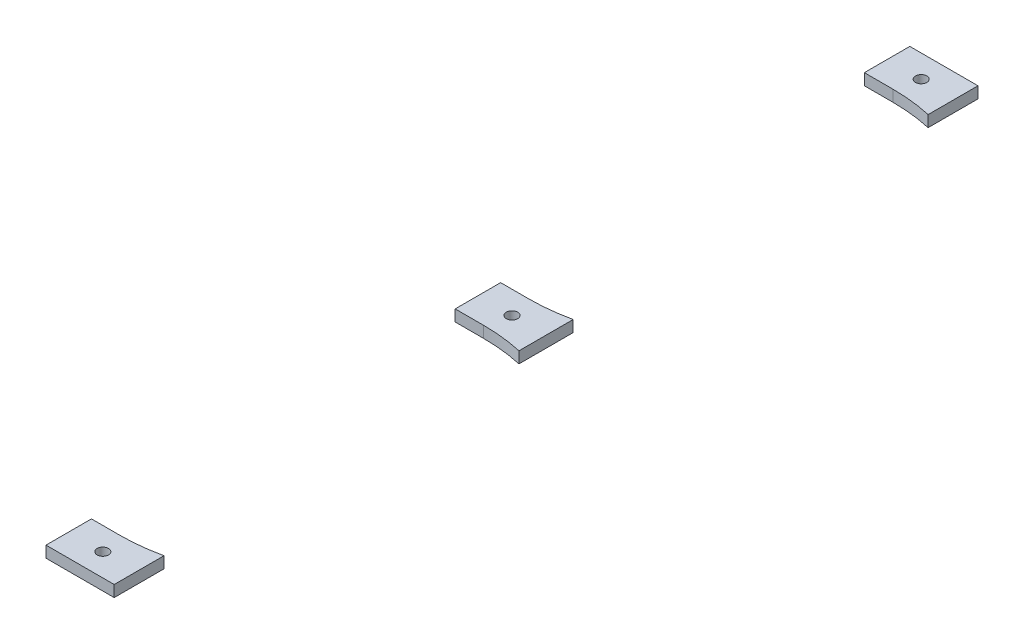
ISO-10303-21;
HEADER;
FILE_DESCRIPTION(('STEP AP214'),'2;1');
FILE_NAME('part.step','',(''),(''),'','','');
FILE_SCHEMA(('AUTOMOTIVE_DESIGN { 1 0 10303 214 1 1 1 1 }'));
ENDSEC;
DATA;
#1=APPLICATION_CONTEXT('core data for automotive mechanical design processes');
#2=APPLICATION_PROTOCOL_DEFINITION('international standard','automotive_design',2000,#1);
#3=PRODUCT_CONTEXT('',#1,'mechanical');
#4=PRODUCT('Part','Part','',(#3));
#5=PRODUCT_RELATED_PRODUCT_CATEGORY('part','',(#4));
#6=PRODUCT_DEFINITION_FORMATION('','',#4);
#7=PRODUCT_DEFINITION_CONTEXT('part definition',#1,'design');
#8=PRODUCT_DEFINITION('design','',#6,#7);
#9=PRODUCT_DEFINITION_SHAPE('','',#8);
#10=(LENGTH_UNIT() NAMED_UNIT(*) SI_UNIT(.MILLI.,.METRE.));
#11=(NAMED_UNIT(*) PLANE_ANGLE_UNIT() SI_UNIT($,.RADIAN.));
#12=(NAMED_UNIT(*) SI_UNIT($,.STERADIAN.) SOLID_ANGLE_UNIT());
#13=UNCERTAINTY_MEASURE_WITH_UNIT(LENGTH_MEASURE(1.E-05),#10,'distance_accuracy_value','');
#14=(GEOMETRIC_REPRESENTATION_CONTEXT(3) GLOBAL_UNCERTAINTY_ASSIGNED_CONTEXT((#13)) GLOBAL_UNIT_ASSIGNED_CONTEXT((#10,
#11,#12)) REPRESENTATION_CONTEXT('',''));
#15=CARTESIAN_POINT('',(0.,0.,0.));
#16=DIRECTION('',(0.,0.,1.));
#17=DIRECTION('',(1.,0.,0.));
#18=AXIS2_PLACEMENT_3D('',#15,#16,#17);
#19=CARTESIAN_POINT('',(-177.8,-0.00099999999999989,-241.3));
#20=DIRECTION('',(-1.,0.,0.));
#21=DIRECTION('',(0.,0.,1.));
#22=AXIS2_PLACEMENT_3D('',#19,#20,#21);
#23=PLANE('',#22);
#24=DIRECTION('',(0.,0.,-1.));
#25=VECTOR('',#24,1.);
#26=CARTESIAN_POINT('',(-177.8,6.35,-120.65));
#27=LINE('',#26,#25);
#28=CARTESIAN_POINT('',(-177.8,6.35,15.1606567754254));
#29=VERTEX_POINT('',#28);
#30=CARTESIAN_POINT('',(-177.8,6.35,-15.1606567754254));
#31=VERTEX_POINT('',#30);
#32=EDGE_CURVE('P0_E35',#29,#31,#27,.T.);
#33=ORIENTED_EDGE('',*,*,#32,.F.);
#34=DIRECTION('',(0.,1.,0.));
#35=VECTOR('',#34,1.);
#36=CARTESIAN_POINT('',(-177.8,6.35,15.1606567754254));
#37=LINE('',#36,#35);
#38=CARTESIAN_POINT('',(-177.8,0.,15.1606567754254));
#39=VERTEX_POINT('',#38);
#40=EDGE_CURVE('P0_E104',#39,#29,#37,.T.);
#41=ORIENTED_EDGE('',*,*,#40,.F.);
#42=DIRECTION('',(0.,0.,1.));
#43=VECTOR('',#42,1.);
#44=CARTESIAN_POINT('',(-177.8,0.,-120.65));
#45=LINE('',#44,#43);
#46=CARTESIAN_POINT('',(-177.8,0.,-15.1606567754254));
#47=VERTEX_POINT('',#46);
#48=EDGE_CURVE('P0_E11',#47,#39,#45,.T.);
#49=ORIENTED_EDGE('',*,*,#48,.F.);
#50=DIRECTION('',(0.,-1.,0.));
#51=VECTOR('',#50,1.);
#52=CARTESIAN_POINT('',(-177.8,6.35,-15.1606567754254));
#53=LINE('',#52,#51);
#54=EDGE_CURVE('P0_E111',#31,#47,#53,.T.);
#55=ORIENTED_EDGE('',*,*,#54,.F.);
#56=EDGE_LOOP('',(#33,#41,#49,#55));
#57=FACE_BOUND('',#56,.T.);
#58=ADVANCED_FACE('P0_F16',(#57),#23,.F.);
#59=CARTESIAN_POINT('',(0.,0.,0.));
#60=DIRECTION('',(0.,1.,0.));
#61=DIRECTION('',(0.,0.,1.));
#62=AXIS2_PLACEMENT_3D('',#59,#60,#61);
#63=PLANE('',#62);
#64=ORIENTED_EDGE('',*,*,#48,.T.);
#65=CARTESIAN_POINT('',(-200.025,0.,114.3));
#66=DIRECTION('',(0.,1.,0.));
#67=DIRECTION('',(1.,0.,0.));
#68=AXIS2_PLACEMENT_3D('',#65,#66,#67);
#69=CIRCLE('',#68,101.6);
#70=CARTESIAN_POINT('',(-200.025,0.,12.7));
#71=VERTEX_POINT('',#70);
#72=EDGE_CURVE('P0_E26',#39,#71,#69,.T.);
#73=ORIENTED_EDGE('',*,*,#72,.T.);
#74=DIRECTION('',(-1.,0.,0.));
#75=VECTOR('',#74,1.);
#76=CARTESIAN_POINT('',(-107.95,0.,12.7));
#77=LINE('',#76,#75);
#78=CARTESIAN_POINT('',(-215.9,0.,12.7));
#79=VERTEX_POINT('',#78);
#80=EDGE_CURVE('P0_E118',#71,#79,#77,.T.);
#81=ORIENTED_EDGE('',*,*,#80,.T.);
#82=DIRECTION('',(0.,0.,-1.));
#83=VECTOR('',#82,1.);
#84=CARTESIAN_POINT('',(-215.9,0.,279.4));
#85=LINE('',#84,#83);
#86=CARTESIAN_POINT('',(-215.9,0.,-12.7));
#87=VERTEX_POINT('',#86);
#88=EDGE_CURVE('P0_E92',#79,#87,#85,.T.);
#89=ORIENTED_EDGE('',*,*,#88,.T.);
#90=DIRECTION('',(1.,0.,0.));
#91=VECTOR('',#90,1.);
#92=CARTESIAN_POINT('',(-100.0125,0.,-12.7));
#93=LINE('',#92,#91);
#94=CARTESIAN_POINT('',(-200.025,0.,-12.7));
#95=VERTEX_POINT('',#94);
#96=EDGE_CURVE('P0_E114',#87,#95,#93,.T.);
#97=ORIENTED_EDGE('',*,*,#96,.T.);
#98=CARTESIAN_POINT('',(-200.025,0.,-114.3));
#99=DIRECTION('',(0.,1.,0.));
#100=DIRECTION('',(1.,0.,0.));
#101=AXIS2_PLACEMENT_3D('',#98,#99,#100);
#102=CIRCLE('',#101,101.6);
#103=EDGE_CURVE('P0_E110',#95,#47,#102,.T.);
#104=ORIENTED_EDGE('',*,*,#103,.T.);
#105=EDGE_LOOP('',(#64,#73,#81,#89,#97,#104));
#106=FACE_BOUND('',#105,.T.);
#107=CARTESIAN_POINT('',(-196.85,0.,0.));
#108=DIRECTION('',(0.,1.,0.));
#109=DIRECTION('',(1.,0.,0.));
#110=AXIS2_PLACEMENT_3D('',#107,#108,#109);
#111=CIRCLE('',#110,3.175);
#112=CARTESIAN_POINT('',(-193.675,0.,0.));
#113=VERTEX_POINT('',#112);
#114=EDGE_CURVE('P0_E107',#113,#113,#111,.T.);
#115=ORIENTED_EDGE('',*,*,#114,.T.);
#116=EDGE_LOOP('',(#115));
#117=FACE_BOUND('',#116,.T.);
#118=ADVANCED_FACE('P0_F131',(#106,#117),#63,.F.);
#119=CARTESIAN_POINT('',(-200.025,6.35,-114.3));
#120=DIRECTION('',(0.,-1.,0.));
#121=DIRECTION('',(0.,0.,-1.));
#122=AXIS2_PLACEMENT_3D('',#119,#120,#121);
#123=CYLINDRICAL_SURFACE('',#122,101.6);
#124=ORIENTED_EDGE('',*,*,#54,.T.);
#125=ORIENTED_EDGE('',*,*,#103,.F.);
#126=DIRECTION('',(0.,-1.,0.));
#127=VECTOR('',#126,1.);
#128=CARTESIAN_POINT('',(-200.025,6.35,-12.7));
#129=LINE('',#128,#127);
#130=CARTESIAN_POINT('',(-200.025,6.35,-12.7));
#131=VERTEX_POINT('',#130);
#132=EDGE_CURVE('P0_E94',#131,#95,#129,.T.);
#133=ORIENTED_EDGE('',*,*,#132,.F.);
#134=CARTESIAN_POINT('',(-200.025,6.35,-114.3));
#135=DIRECTION('',(0.,-1.,0.));
#136=DIRECTION('',(0.,0.,-1.));
#137=AXIS2_PLACEMENT_3D('',#134,#135,#136);
#138=CIRCLE('',#137,101.6);
#139=EDGE_CURVE('P0_E102',#31,#131,#138,.T.);
#140=ORIENTED_EDGE('',*,*,#139,.F.);
#141=EDGE_LOOP('',(#124,#125,#133,#140));
#142=FACE_BOUND('',#141,.T.);
#143=ADVANCED_FACE('P0_F127',(#142),#123,.F.);
#144=CARTESIAN_POINT('',(-200.025,6.35,114.3));
#145=DIRECTION('',(0.,-1.,0.));
#146=DIRECTION('',(0.,0.,-1.));
#147=AXIS2_PLACEMENT_3D('',#144,#145,#146);
#148=CYLINDRICAL_SURFACE('',#147,101.6);
#149=ORIENTED_EDGE('',*,*,#40,.T.);
#150=CARTESIAN_POINT('',(-200.025,6.35,114.3));
#151=DIRECTION('',(0.,-1.,0.));
#152=DIRECTION('',(0.,0.,-1.));
#153=AXIS2_PLACEMENT_3D('',#150,#151,#152);
#154=CIRCLE('',#153,101.6);
#155=CARTESIAN_POINT('',(-200.025,6.35,12.7));
#156=VERTEX_POINT('',#155);
#157=EDGE_CURVE('P0_E81',#156,#29,#154,.T.);
#158=ORIENTED_EDGE('',*,*,#157,.F.);
#159=DIRECTION('',(0.,-1.,0.));
#160=VECTOR('',#159,1.);
#161=CARTESIAN_POINT('',(-200.025,6.35,12.7));
#162=LINE('',#161,#160);
#163=EDGE_CURVE('P0_E78',#156,#71,#162,.T.);
#164=ORIENTED_EDGE('',*,*,#163,.T.);
#165=ORIENTED_EDGE('',*,*,#72,.F.);
#166=EDGE_LOOP('',(#149,#158,#164,#165));
#167=FACE_BOUND('',#166,.T.);
#168=ADVANCED_FACE('P0_F18',(#167),#148,.F.);
#169=CARTESIAN_POINT('',(0.,6.35,0.));
#170=DIRECTION('',(0.,1.,0.));
#171=DIRECTION('',(0.,0.,1.));
#172=AXIS2_PLACEMENT_3D('',#169,#170,#171);
#173=PLANE('',#172);
#174=ORIENTED_EDGE('',*,*,#32,.T.);
#175=ORIENTED_EDGE('',*,*,#139,.T.);
#176=DIRECTION('',(-1.,0.,0.));
#177=VECTOR('',#176,1.);
#178=CARTESIAN_POINT('',(-100.0125,6.35,-12.7));
#179=LINE('',#178,#177);
#180=CARTESIAN_POINT('',(-215.9,6.35,-12.7));
#181=VERTEX_POINT('',#180);
#182=EDGE_CURVE('P0_E87',#131,#181,#179,.T.);
#183=ORIENTED_EDGE('',*,*,#182,.T.);
#184=DIRECTION('',(0.,0.,1.));
#185=VECTOR('',#184,1.);
#186=CARTESIAN_POINT('',(-215.9,6.35,279.4));
#187=LINE('',#186,#185);
#188=CARTESIAN_POINT('',(-215.9,6.35,12.7));
#189=VERTEX_POINT('',#188);
#190=EDGE_CURVE('P0_E67',#181,#189,#187,.T.);
#191=ORIENTED_EDGE('',*,*,#190,.T.);
#192=DIRECTION('',(1.,0.,0.));
#193=VECTOR('',#192,1.);
#194=CARTESIAN_POINT('',(-107.95,6.35,12.7));
#195=LINE('',#194,#193);
#196=EDGE_CURVE('P0_E74',#189,#156,#195,.T.);
#197=ORIENTED_EDGE('',*,*,#196,.T.);
#198=ORIENTED_EDGE('',*,*,#157,.T.);
#199=EDGE_LOOP('',(#174,#175,#183,#191,#197,#198));
#200=FACE_BOUND('',#199,.T.);
#201=CARTESIAN_POINT('',(-196.85,6.35000000000005,0.));
#202=DIRECTION('',(0.,-1.,0.));
#203=DIRECTION('',(0.,0.,-1.));
#204=AXIS2_PLACEMENT_3D('',#201,#202,#203);
#205=CIRCLE('',#204,3.175);
#206=CARTESIAN_POINT('',(-196.85,6.35000000000005,-3.175));
#207=VERTEX_POINT('',#206);
#208=EDGE_CURVE('P0_E96',#207,#207,#205,.T.);
#209=ORIENTED_EDGE('',*,*,#208,.T.);
#210=EDGE_LOOP('',(#209));
#211=FACE_BOUND('',#210,.T.);
#212=ADVANCED_FACE('P0_F83',(#200,#211),#173,.T.);
#213=CARTESIAN_POINT('',(-196.85,-641.256610914373,0.));
#214=DIRECTION('',(0.,1.,0.));
#215=DIRECTION('',(1.,0.,0.));
#216=AXIS2_PLACEMENT_3D('',#213,#214,#215);
#217=CYLINDRICAL_SURFACE('',#216,3.175);
#218=ORIENTED_EDGE('',*,*,#114,.F.);
#219=EDGE_LOOP('',(#218));
#220=FACE_BOUND('',#219,.T.);
#221=ORIENTED_EDGE('',*,*,#208,.F.);
#222=EDGE_LOOP('',(#221));
#223=FACE_BOUND('',#222,.T.);
#224=ADVANCED_FACE('P0_F141',(#220,#223),#217,.F.);
#225=CARTESIAN_POINT('',(-215.9,6.35,12.7));
#226=DIRECTION('',(0.,0.,-1.));
#227=DIRECTION('',(-1.,0.,0.));
#228=AXIS2_PLACEMENT_3D('',#225,#226,#227);
#229=PLANE('',#228);
#230=ORIENTED_EDGE('',*,*,#196,.F.);
#231=DIRECTION('',(0.,1.,0.));
#232=VECTOR('',#231,1.);
#233=CARTESIAN_POINT('',(-215.9,3.175,12.7));
#234=LINE('',#233,#232);
#235=EDGE_CURVE('P0_E76',#79,#189,#234,.T.);
#236=ORIENTED_EDGE('',*,*,#235,.F.);
#237=ORIENTED_EDGE('',*,*,#80,.F.);
#238=ORIENTED_EDGE('',*,*,#163,.F.);
#239=EDGE_LOOP('',(#230,#236,#237,#238));
#240=FACE_BOUND('',#239,.T.);
#241=ADVANCED_FACE('P0_F75',(#240),#229,.F.);
#242=CARTESIAN_POINT('',(-200.025,6.35,-12.7));
#243=DIRECTION('',(0.,0.,1.));
#244=DIRECTION('',(1.,0.,0.));
#245=AXIS2_PLACEMENT_3D('',#242,#243,#244);
#246=PLANE('',#245);
#247=ORIENTED_EDGE('',*,*,#182,.F.);
#248=ORIENTED_EDGE('',*,*,#132,.T.);
#249=ORIENTED_EDGE('',*,*,#96,.F.);
#250=DIRECTION('',(0.,-1.,0.));
#251=VECTOR('',#250,1.);
#252=CARTESIAN_POINT('',(-215.9,3.175,-12.7));
#253=LINE('',#252,#251);
#254=EDGE_CURVE('P0_E20',#181,#87,#253,.T.);
#255=ORIENTED_EDGE('',*,*,#254,.F.);
#256=EDGE_LOOP('',(#247,#248,#249,#255));
#257=FACE_BOUND('',#256,.T.);
#258=ADVANCED_FACE('P0_F129',(#257),#246,.F.);
#259=CARTESIAN_POINT('',(-215.9,0.,-279.4));
#260=DIRECTION('',(-1.,0.,0.));
#261=DIRECTION('',(0.,0.,1.));
#262=AXIS2_PLACEMENT_3D('',#259,#260,#261);
#263=PLANE('',#262);
#264=ORIENTED_EDGE('',*,*,#235,.T.);
#265=ORIENTED_EDGE('',*,*,#190,.F.);
#266=ORIENTED_EDGE('',*,*,#254,.T.);
#267=ORIENTED_EDGE('',*,*,#88,.F.);
#268=EDGE_LOOP('',(#264,#265,#266,#267));
#269=FACE_BOUND('',#268,.T.);
#270=ADVANCED_FACE('P0_F90',(#269),#263,.T.);
#271=CLOSED_SHELL('',(#58,#118,#143,#168,#212,#224,#241,#258,#270));
#272=MANIFOLD_SOLID_BREP('P0_B1',#271);
#273=CARTESIAN_POINT('',(-177.8,-0.00099999999999989,-241.3));
#274=DIRECTION('',(-1.,0.,0.));
#275=DIRECTION('',(0.,0.,1.));
#276=AXIS2_PLACEMENT_3D('',#273,#274,#275);
#277=PLANE('',#276);
#278=DIRECTION('',(0.,-1.,0.));
#279=VECTOR('',#278,1.);
#280=CARTESIAN_POINT('',(-177.8,3.1745,-241.3));
#281=LINE('',#280,#279);
#282=CARTESIAN_POINT('',(-177.8,6.35,-241.3));
#283=VERTEX_POINT('',#282);
#284=CARTESIAN_POINT('',(-177.8,0.,-241.3));
#285=VERTEX_POINT('',#284);
#286=EDGE_CURVE('P1_E35',#283,#285,#281,.T.);
#287=ORIENTED_EDGE('',*,*,#286,.F.);
#288=DIRECTION('',(0.,0.,-1.));
#289=VECTOR('',#288,1.);
#290=CARTESIAN_POINT('',(-177.8,6.35,-120.65));
#291=LINE('',#290,#289);
#292=CARTESIAN_POINT('',(-177.8,6.35,-213.439343224575));
#293=VERTEX_POINT('',#292);
#294=EDGE_CURVE('P1_E95',#293,#283,#291,.T.);
#295=ORIENTED_EDGE('',*,*,#294,.F.);
#296=DIRECTION('',(0.,1.,0.));
#297=VECTOR('',#296,1.);
#298=CARTESIAN_POINT('',(-177.8,6.35,-213.439343224575));
#299=LINE('',#298,#297);
#300=CARTESIAN_POINT('',(-177.8,0.,-213.439343224575));
#301=VERTEX_POINT('',#300);
#302=EDGE_CURVE('P1_E11',#301,#293,#299,.T.);
#303=ORIENTED_EDGE('',*,*,#302,.F.);
#304=DIRECTION('',(0.,0.,1.));
#305=VECTOR('',#304,1.);
#306=CARTESIAN_POINT('',(-177.8,0.,-120.65));
#307=LINE('',#306,#305);
#308=EDGE_CURVE('P1_E81',#285,#301,#307,.T.);
#309=ORIENTED_EDGE('',*,*,#308,.F.);
#310=EDGE_LOOP('',(#287,#295,#303,#309));
#311=FACE_BOUND('',#310,.T.);
#312=ADVANCED_FACE('P1_F16',(#311),#277,.F.);
#313=CARTESIAN_POINT('',(-200.025,6.35,-114.3));
#314=DIRECTION('',(0.,-1.,0.));
#315=DIRECTION('',(0.,0.,-1.));
#316=AXIS2_PLACEMENT_3D('',#313,#314,#315);
#317=CYLINDRICAL_SURFACE('',#316,101.6);
#318=ORIENTED_EDGE('',*,*,#302,.T.);
#319=CARTESIAN_POINT('',(-200.025,6.35,-114.3));
#320=DIRECTION('',(0.,-1.,0.));
#321=DIRECTION('',(0.,0.,-1.));
#322=AXIS2_PLACEMENT_3D('',#319,#320,#321);
#323=CIRCLE('',#322,101.6);
#324=CARTESIAN_POINT('',(-200.025,6.35,-215.9));
#325=VERTEX_POINT('',#324);
#326=EDGE_CURVE('P1_E99',#325,#293,#323,.T.);
#327=ORIENTED_EDGE('',*,*,#326,.F.);
#328=DIRECTION('',(0.,-1.,0.));
#329=VECTOR('',#328,1.);
#330=CARTESIAN_POINT('',(-200.025,6.35,-215.9));
#331=LINE('',#330,#329);
#332=CARTESIAN_POINT('',(-200.025,0.,-215.9));
#333=VERTEX_POINT('',#332);
#334=EDGE_CURVE('P1_E26',#325,#333,#331,.T.);
#335=ORIENTED_EDGE('',*,*,#334,.T.);
#336=CARTESIAN_POINT('',(-200.025,0.,-114.3));
#337=DIRECTION('',(0.,1.,0.));
#338=DIRECTION('',(1.,0.,0.));
#339=AXIS2_PLACEMENT_3D('',#336,#337,#338);
#340=CIRCLE('',#339,101.6);
#341=EDGE_CURVE('P1_E85',#301,#333,#340,.T.);
#342=ORIENTED_EDGE('',*,*,#341,.F.);
#343=EDGE_LOOP('',(#318,#327,#335,#342));
#344=FACE_BOUND('',#343,.T.);
#345=ADVANCED_FACE('P1_F18',(#344),#317,.F.);
#346=CARTESIAN_POINT('',(0.,6.35,0.));
#347=DIRECTION('',(0.,1.,0.));
#348=DIRECTION('',(0.,0.,1.));
#349=AXIS2_PLACEMENT_3D('',#346,#347,#348);
#350=PLANE('',#349);
#351=ORIENTED_EDGE('',*,*,#294,.T.);
#352=DIRECTION('',(-1.,0.,0.));
#353=VECTOR('',#352,1.);
#354=CARTESIAN_POINT('',(107.95,6.35,-241.3));
#355=LINE('',#354,#353);
#356=CARTESIAN_POINT('',(-215.9,6.35,-241.3));
#357=VERTEX_POINT('',#356);
#358=EDGE_CURVE('P1_E92',#283,#357,#355,.T.);
#359=ORIENTED_EDGE('',*,*,#358,.T.);
#360=DIRECTION('',(0.,0.,1.));
#361=VECTOR('',#360,1.);
#362=CARTESIAN_POINT('',(-215.9,6.35,279.4));
#363=LINE('',#362,#361);
#364=CARTESIAN_POINT('',(-215.9,6.35,-215.9));
#365=VERTEX_POINT('',#364);
#366=EDGE_CURVE('P1_E96',#357,#365,#363,.T.);
#367=ORIENTED_EDGE('',*,*,#366,.T.);
#368=DIRECTION('',(1.,0.,0.));
#369=VECTOR('',#368,1.);
#370=CARTESIAN_POINT('',(-107.95,6.35,-215.9));
#371=LINE('',#370,#369);
#372=EDGE_CURVE('P1_E79',#365,#325,#371,.T.);
#373=ORIENTED_EDGE('',*,*,#372,.T.);
#374=ORIENTED_EDGE('',*,*,#326,.T.);
#375=EDGE_LOOP('',(#351,#359,#367,#373,#374));
#376=FACE_BOUND('',#375,.T.);
#377=CARTESIAN_POINT('',(-196.85,6.35000000000005,-228.6));
#378=DIRECTION('',(0.,-1.,0.));
#379=DIRECTION('',(0.,0.,-1.));
#380=AXIS2_PLACEMENT_3D('',#377,#378,#379);
#381=CIRCLE('',#380,3.175);
#382=CARTESIAN_POINT('',(-196.85,6.35000000000005,-231.775));
#383=VERTEX_POINT('',#382);
#384=EDGE_CURVE('P1_E100',#383,#383,#381,.T.);
#385=ORIENTED_EDGE('',*,*,#384,.T.);
#386=EDGE_LOOP('',(#385));
#387=FACE_BOUND('',#386,.T.);
#388=ADVANCED_FACE('P1_F112',(#376,#387),#350,.T.);
#389=CARTESIAN_POINT('',(-196.85,-641.256610914373,-228.6));
#390=DIRECTION('',(0.,1.,0.));
#391=DIRECTION('',(1.,0.,0.));
#392=AXIS2_PLACEMENT_3D('',#389,#390,#391);
#393=CYLINDRICAL_SURFACE('',#392,3.175);
#394=CARTESIAN_POINT('',(-196.85,0.,-228.6));
#395=DIRECTION('',(0.,1.,0.));
#396=DIRECTION('',(1.,0.,0.));
#397=AXIS2_PLACEMENT_3D('',#394,#395,#396);
#398=CIRCLE('',#397,3.175);
#399=CARTESIAN_POINT('',(-193.675,0.,-228.6));
#400=VERTEX_POINT('',#399);
#401=EDGE_CURVE('P1_E103',#400,#400,#398,.T.);
#402=ORIENTED_EDGE('',*,*,#401,.F.);
#403=EDGE_LOOP('',(#402));
#404=FACE_BOUND('',#403,.T.);
#405=ORIENTED_EDGE('',*,*,#384,.F.);
#406=EDGE_LOOP('',(#405));
#407=FACE_BOUND('',#406,.T.);
#408=ADVANCED_FACE('P1_F125',(#404,#407),#393,.F.);
#409=CARTESIAN_POINT('',(215.9,6.35,-241.3));
#410=DIRECTION('',(0.,0.,1.));
#411=DIRECTION('',(1.,0.,0.));
#412=AXIS2_PLACEMENT_3D('',#409,#410,#411);
#413=PLANE('',#412);
#414=ORIENTED_EDGE('',*,*,#286,.T.);
#415=DIRECTION('',(1.,0.,0.));
#416=VECTOR('',#415,1.);
#417=CARTESIAN_POINT('',(107.95,0.,-241.3));
#418=LINE('',#417,#416);
#419=CARTESIAN_POINT('',(-215.9,0.,-241.3));
#420=VERTEX_POINT('',#419);
#421=EDGE_CURVE('P1_E60',#420,#285,#418,.T.);
#422=ORIENTED_EDGE('',*,*,#421,.F.);
#423=DIRECTION('',(0.,-1.,0.));
#424=VECTOR('',#423,1.);
#425=CARTESIAN_POINT('',(-215.9,3.175,-241.3));
#426=LINE('',#425,#424);
#427=EDGE_CURVE('P1_E70',#357,#420,#426,.T.);
#428=ORIENTED_EDGE('',*,*,#427,.F.);
#429=ORIENTED_EDGE('',*,*,#358,.F.);
#430=EDGE_LOOP('',(#414,#422,#428,#429));
#431=FACE_BOUND('',#430,.T.);
#432=ADVANCED_FACE('P1_F128',(#431),#413,.F.);
#433=CARTESIAN_POINT('',(-215.9,0.,-279.4));
#434=DIRECTION('',(-1.,0.,0.));
#435=DIRECTION('',(0.,0.,1.));
#436=AXIS2_PLACEMENT_3D('',#433,#434,#435);
#437=PLANE('',#436);
#438=ORIENTED_EDGE('',*,*,#427,.T.);
#439=DIRECTION('',(0.,0.,-1.));
#440=VECTOR('',#439,1.);
#441=CARTESIAN_POINT('',(-215.9,0.,279.4));
#442=LINE('',#441,#440);
#443=CARTESIAN_POINT('',(-215.9,0.,-215.9));
#444=VERTEX_POINT('',#443);
#445=EDGE_CURVE('P1_E66',#444,#420,#442,.T.);
#446=ORIENTED_EDGE('',*,*,#445,.F.);
#447=DIRECTION('',(0.,1.,0.));
#448=VECTOR('',#447,1.);
#449=CARTESIAN_POINT('',(-215.9,3.175,-215.9));
#450=LINE('',#449,#448);
#451=EDGE_CURVE('P1_E69',#444,#365,#450,.T.);
#452=ORIENTED_EDGE('',*,*,#451,.T.);
#453=ORIENTED_EDGE('',*,*,#366,.F.);
#454=EDGE_LOOP('',(#438,#446,#452,#453));
#455=FACE_BOUND('',#454,.T.);
#456=ADVANCED_FACE('P1_F68',(#455),#437,.T.);
#457=CARTESIAN_POINT('',(-215.9,6.35,-215.9));
#458=DIRECTION('',(0.,0.,-1.));
#459=DIRECTION('',(-1.,0.,0.));
#460=AXIS2_PLACEMENT_3D('',#457,#458,#459);
#461=PLANE('',#460);
#462=ORIENTED_EDGE('',*,*,#372,.F.);
#463=ORIENTED_EDGE('',*,*,#451,.F.);
#464=DIRECTION('',(-1.,0.,0.));
#465=VECTOR('',#464,1.);
#466=CARTESIAN_POINT('',(-107.95,0.,-215.9));
#467=LINE('',#466,#465);
#468=EDGE_CURVE('P1_E20',#333,#444,#467,.T.);
#469=ORIENTED_EDGE('',*,*,#468,.F.);
#470=ORIENTED_EDGE('',*,*,#334,.F.);
#471=EDGE_LOOP('',(#462,#463,#469,#470));
#472=FACE_BOUND('',#471,.T.);
#473=ADVANCED_FACE('P1_F76',(#472),#461,.F.);
#474=CARTESIAN_POINT('',(0.,0.,0.));
#475=DIRECTION('',(0.,1.,0.));
#476=DIRECTION('',(0.,0.,1.));
#477=AXIS2_PLACEMENT_3D('',#474,#475,#476);
#478=PLANE('',#477);
#479=ORIENTED_EDGE('',*,*,#308,.T.);
#480=ORIENTED_EDGE('',*,*,#341,.T.);
#481=ORIENTED_EDGE('',*,*,#468,.T.);
#482=ORIENTED_EDGE('',*,*,#445,.T.);
#483=ORIENTED_EDGE('',*,*,#421,.T.);
#484=EDGE_LOOP('',(#479,#480,#481,#482,#483));
#485=FACE_BOUND('',#484,.T.);
#486=ORIENTED_EDGE('',*,*,#401,.T.);
#487=EDGE_LOOP('',(#486));
#488=FACE_BOUND('',#487,.T.);
#489=ADVANCED_FACE('P1_F82',(#485,#488),#478,.F.);
#490=CLOSED_SHELL('',(#312,#345,#388,#408,#432,#456,#473,#489));
#491=MANIFOLD_SOLID_BREP('P1_B1',#490);
#492=CARTESIAN_POINT('',(-215.9,0.,-279.4));
#493=DIRECTION('',(-1.,0.,0.));
#494=DIRECTION('',(0.,0.,1.));
#495=AXIS2_PLACEMENT_3D('',#492,#493,#494);
#496=PLANE('',#495);
#497=DIRECTION('',(0.,1.,0.));
#498=VECTOR('',#497,1.);
#499=CARTESIAN_POINT('',(-215.9,3.175,241.3));
#500=LINE('',#499,#498);
#501=CARTESIAN_POINT('',(-215.9,0.,241.3));
#502=VERTEX_POINT('',#501);
#503=CARTESIAN_POINT('',(-215.9,6.35,241.3));
#504=VERTEX_POINT('',#503);
#505=EDGE_CURVE('P2_E11',#502,#504,#500,.T.);
#506=ORIENTED_EDGE('',*,*,#505,.T.);
#507=DIRECTION('',(0.,0.,1.));
#508=VECTOR('',#507,1.);
#509=CARTESIAN_POINT('',(-215.9,6.35,279.4));
#510=LINE('',#509,#508);
#511=CARTESIAN_POINT('',(-215.9,6.35,215.9));
#512=VERTEX_POINT('',#511);
#513=EDGE_CURVE('P2_E35',#512,#504,#510,.T.);
#514=ORIENTED_EDGE('',*,*,#513,.F.);
#515=DIRECTION('',(0.,-1.,0.));
#516=VECTOR('',#515,1.);
#517=CARTESIAN_POINT('',(-215.9,3.175,215.9));
#518=LINE('',#517,#516);
#519=CARTESIAN_POINT('',(-215.9,0.,215.9));
#520=VERTEX_POINT('',#519);
#521=EDGE_CURVE('P2_E26',#512,#520,#518,.T.);
#522=ORIENTED_EDGE('',*,*,#521,.T.);
#523=DIRECTION('',(0.,0.,-1.));
#524=VECTOR('',#523,1.);
#525=CARTESIAN_POINT('',(-215.9,0.,279.4));
#526=LINE('',#525,#524);
#527=EDGE_CURVE('P2_E70',#502,#520,#526,.T.);
#528=ORIENTED_EDGE('',*,*,#527,.F.);
#529=EDGE_LOOP('',(#506,#514,#522,#528));
#530=FACE_BOUND('',#529,.T.);
#531=ADVANCED_FACE('P2_F16',(#530),#496,.T.);
#532=CARTESIAN_POINT('',(-200.025,6.35,215.9));
#533=DIRECTION('',(0.,0.,1.));
#534=DIRECTION('',(1.,0.,0.));
#535=AXIS2_PLACEMENT_3D('',#532,#533,#534);
#536=PLANE('',#535);
#537=DIRECTION('',(-1.,0.,0.));
#538=VECTOR('',#537,1.);
#539=CARTESIAN_POINT('',(-100.0125,6.35,215.9));
#540=LINE('',#539,#538);
#541=CARTESIAN_POINT('',(-200.025,6.35,215.9));
#542=VERTEX_POINT('',#541);
#543=EDGE_CURVE('P2_E96',#542,#512,#540,.T.);
#544=ORIENTED_EDGE('',*,*,#543,.F.);
#545=DIRECTION('',(0.,-1.,0.));
#546=VECTOR('',#545,1.);
#547=CARTESIAN_POINT('',(-200.025,6.35,215.9));
#548=LINE('',#547,#546);
#549=CARTESIAN_POINT('',(-200.025,0.,215.9));
#550=VERTEX_POINT('',#549);
#551=EDGE_CURVE('P2_E102',#542,#550,#548,.T.);
#552=ORIENTED_EDGE('',*,*,#551,.T.);
#553=DIRECTION('',(1.,0.,0.));
#554=VECTOR('',#553,1.);
#555=CARTESIAN_POINT('',(-100.0125,0.,215.9));
#556=LINE('',#555,#554);
#557=EDGE_CURVE('P2_E86',#520,#550,#556,.T.);
#558=ORIENTED_EDGE('',*,*,#557,.F.);
#559=ORIENTED_EDGE('',*,*,#521,.F.);
#560=EDGE_LOOP('',(#544,#552,#558,#559));
#561=FACE_BOUND('',#560,.T.);
#562=ADVANCED_FACE('P2_F113',(#561),#536,.F.);
#563=CARTESIAN_POINT('',(-200.025,6.35,114.3));
#564=DIRECTION('',(0.,-1.,0.));
#565=DIRECTION('',(0.,0.,-1.));
#566=AXIS2_PLACEMENT_3D('',#563,#564,#565);
#567=CYLINDRICAL_SURFACE('',#566,101.6);
#568=DIRECTION('',(0.,-1.,0.));
#569=VECTOR('',#568,1.);
#570=CARTESIAN_POINT('',(-177.8,6.35,213.439343224575));
#571=LINE('',#570,#569);
#572=CARTESIAN_POINT('',(-177.8,6.35,213.439343224575));
#573=VERTEX_POINT('',#572);
#574=CARTESIAN_POINT('',(-177.8,0.,213.439343224575));
#575=VERTEX_POINT('',#574);
#576=EDGE_CURVE('P2_E94',#573,#575,#571,.T.);
#577=ORIENTED_EDGE('',*,*,#576,.T.);
#578=CARTESIAN_POINT('',(-200.025,0.,114.3));
#579=DIRECTION('',(0.,1.,0.));
#580=DIRECTION('',(1.,0.,0.));
#581=AXIS2_PLACEMENT_3D('',#578,#579,#580);
#582=CIRCLE('',#581,101.6);
#583=EDGE_CURVE('P2_E75',#550,#575,#582,.T.);
#584=ORIENTED_EDGE('',*,*,#583,.F.);
#585=ORIENTED_EDGE('',*,*,#551,.F.);
#586=CARTESIAN_POINT('',(-200.025,6.35,114.3));
#587=DIRECTION('',(0.,-1.,0.));
#588=DIRECTION('',(0.,0.,-1.));
#589=AXIS2_PLACEMENT_3D('',#586,#587,#588);
#590=CIRCLE('',#589,101.6);
#591=EDGE_CURVE('P2_E90',#573,#542,#590,.T.);
#592=ORIENTED_EDGE('',*,*,#591,.F.);
#593=EDGE_LOOP('',(#577,#584,#585,#592));
#594=FACE_BOUND('',#593,.T.);
#595=ADVANCED_FACE('P2_F18',(#594),#567,.F.);
#596=CARTESIAN_POINT('',(-196.85,-641.256610914373,228.6));
#597=DIRECTION('',(0.,1.,0.));
#598=DIRECTION('',(1.,0.,0.));
#599=AXIS2_PLACEMENT_3D('',#596,#597,#598);
#600=CYLINDRICAL_SURFACE('',#599,3.175);
#601=CARTESIAN_POINT('',(-196.85,0.,228.6));
#602=DIRECTION('',(0.,1.,0.));
#603=DIRECTION('',(1.,0.,0.));
#604=AXIS2_PLACEMENT_3D('',#601,#602,#603);
#605=CIRCLE('',#604,3.175);
#606=CARTESIAN_POINT('',(-193.675,0.,228.6));
#607=VERTEX_POINT('',#606);
#608=EDGE_CURVE('P2_E82',#607,#607,#605,.T.);
#609=ORIENTED_EDGE('',*,*,#608,.F.);
#610=EDGE_LOOP('',(#609));
#611=FACE_BOUND('',#610,.T.);
#612=CARTESIAN_POINT('',(-196.85,6.35000000000005,228.6));
#613=DIRECTION('',(0.,-1.,0.));
#614=DIRECTION('',(0.,0.,-1.));
#615=AXIS2_PLACEMENT_3D('',#612,#613,#614);
#616=CIRCLE('',#615,3.175);
#617=CARTESIAN_POINT('',(-196.85,6.35000000000005,225.425));
#618=VERTEX_POINT('',#617);
#619=EDGE_CURVE('P2_E91',#618,#618,#616,.T.);
#620=ORIENTED_EDGE('',*,*,#619,.F.);
#621=EDGE_LOOP('',(#620));
#622=FACE_BOUND('',#621,.T.);
#623=ADVANCED_FACE('P2_F125',(#611,#622),#600,.F.);
#624=CARTESIAN_POINT('',(0.,6.35,0.));
#625=DIRECTION('',(0.,1.,0.));
#626=DIRECTION('',(0.,0.,1.));
#627=AXIS2_PLACEMENT_3D('',#624,#625,#626);
#628=PLANE('',#627);
#629=ORIENTED_EDGE('',*,*,#619,.T.);
#630=EDGE_LOOP('',(#629));
#631=FACE_BOUND('',#630,.T.);
#632=DIRECTION('',(0.,0.,-1.));
#633=VECTOR('',#632,1.);
#634=CARTESIAN_POINT('',(-177.8,6.35,-120.65));
#635=LINE('',#634,#633);
#636=CARTESIAN_POINT('',(-177.8,6.35,241.3));
#637=VERTEX_POINT('',#636);
#638=EDGE_CURVE('P2_E81',#637,#573,#635,.T.);
#639=ORIENTED_EDGE('',*,*,#638,.T.);
#640=ORIENTED_EDGE('',*,*,#591,.T.);
#641=ORIENTED_EDGE('',*,*,#543,.T.);
#642=ORIENTED_EDGE('',*,*,#513,.T.);
#643=DIRECTION('',(1.,0.,0.));
#644=VECTOR('',#643,1.);
#645=CARTESIAN_POINT('',(-107.95,6.35,241.3));
#646=LINE('',#645,#644);
#647=EDGE_CURVE('P2_E57',#504,#637,#646,.T.);
#648=ORIENTED_EDGE('',*,*,#647,.T.);
#649=EDGE_LOOP('',(#639,#640,#641,#642,#648));
#650=FACE_BOUND('',#649,.T.);
#651=ADVANCED_FACE('P2_F110',(#631,#650),#628,.T.);
#652=CARTESIAN_POINT('',(0.,0.,0.));
#653=DIRECTION('',(0.,1.,0.));
#654=DIRECTION('',(0.,0.,1.));
#655=AXIS2_PLACEMENT_3D('',#652,#653,#654);
#656=PLANE('',#655);
#657=DIRECTION('',(0.,0.,1.));
#658=VECTOR('',#657,1.);
#659=CARTESIAN_POINT('',(-177.8,0.,-120.65));
#660=LINE('',#659,#658);
#661=CARTESIAN_POINT('',(-177.8,0.,241.3));
#662=VERTEX_POINT('',#661);
#663=EDGE_CURVE('P2_E69',#575,#662,#660,.T.);
#664=ORIENTED_EDGE('',*,*,#663,.T.);
#665=DIRECTION('',(-1.,0.,0.));
#666=VECTOR('',#665,1.);
#667=CARTESIAN_POINT('',(-107.95,0.,241.3));
#668=LINE('',#667,#666);
#669=EDGE_CURVE('P2_E64',#662,#502,#668,.T.);
#670=ORIENTED_EDGE('',*,*,#669,.T.);
#671=ORIENTED_EDGE('',*,*,#527,.T.);
#672=ORIENTED_EDGE('',*,*,#557,.T.);
#673=ORIENTED_EDGE('',*,*,#583,.T.);
#674=EDGE_LOOP('',(#664,#670,#671,#672,#673));
#675=FACE_BOUND('',#674,.T.);
#676=ORIENTED_EDGE('',*,*,#608,.T.);
#677=EDGE_LOOP('',(#676));
#678=FACE_BOUND('',#677,.T.);
#679=ADVANCED_FACE('P2_F72',(#675,#678),#656,.F.);
#680=CARTESIAN_POINT('',(-215.9,6.35,241.3));
#681=DIRECTION('',(0.,0.,-1.));
#682=DIRECTION('',(-1.,0.,0.));
#683=AXIS2_PLACEMENT_3D('',#680,#681,#682);
#684=PLANE('',#683);
#685=DIRECTION('',(0.,1.,0.));
#686=VECTOR('',#685,1.);
#687=CARTESIAN_POINT('',(-177.8,3.1745,241.3));
#688=LINE('',#687,#686);
#689=EDGE_CURVE('P2_E20',#662,#637,#688,.T.);
#690=ORIENTED_EDGE('',*,*,#689,.T.);
#691=ORIENTED_EDGE('',*,*,#647,.F.);
#692=ORIENTED_EDGE('',*,*,#505,.F.);
#693=ORIENTED_EDGE('',*,*,#669,.F.);
#694=EDGE_LOOP('',(#690,#691,#692,#693));
#695=FACE_BOUND('',#694,.T.);
#696=ADVANCED_FACE('P2_F66',(#695),#684,.F.);
#697=CARTESIAN_POINT('',(-177.8,-0.00099999999999989,-241.3));
#698=DIRECTION('',(-1.,0.,0.));
#699=DIRECTION('',(0.,0.,1.));
#700=AXIS2_PLACEMENT_3D('',#697,#698,#699);
#701=PLANE('',#700);
#702=ORIENTED_EDGE('',*,*,#638,.F.);
#703=ORIENTED_EDGE('',*,*,#689,.F.);
#704=ORIENTED_EDGE('',*,*,#663,.F.);
#705=ORIENTED_EDGE('',*,*,#576,.F.);
#706=EDGE_LOOP('',(#702,#703,#704,#705));
#707=FACE_BOUND('',#706,.T.);
#708=ADVANCED_FACE('P2_F80',(#707),#701,.F.);
#709=CLOSED_SHELL('',(#531,#562,#595,#623,#651,#679,#696,#708));
#710=MANIFOLD_SOLID_BREP('P2_B1',#709);
#711=ADVANCED_BREP_SHAPE_REPRESENTATION('',(#18,#272,#491,#710),#14);
#712=SHAPE_DEFINITION_REPRESENTATION(#9,#711);
ENDSEC;
END-ISO-10303-21;
